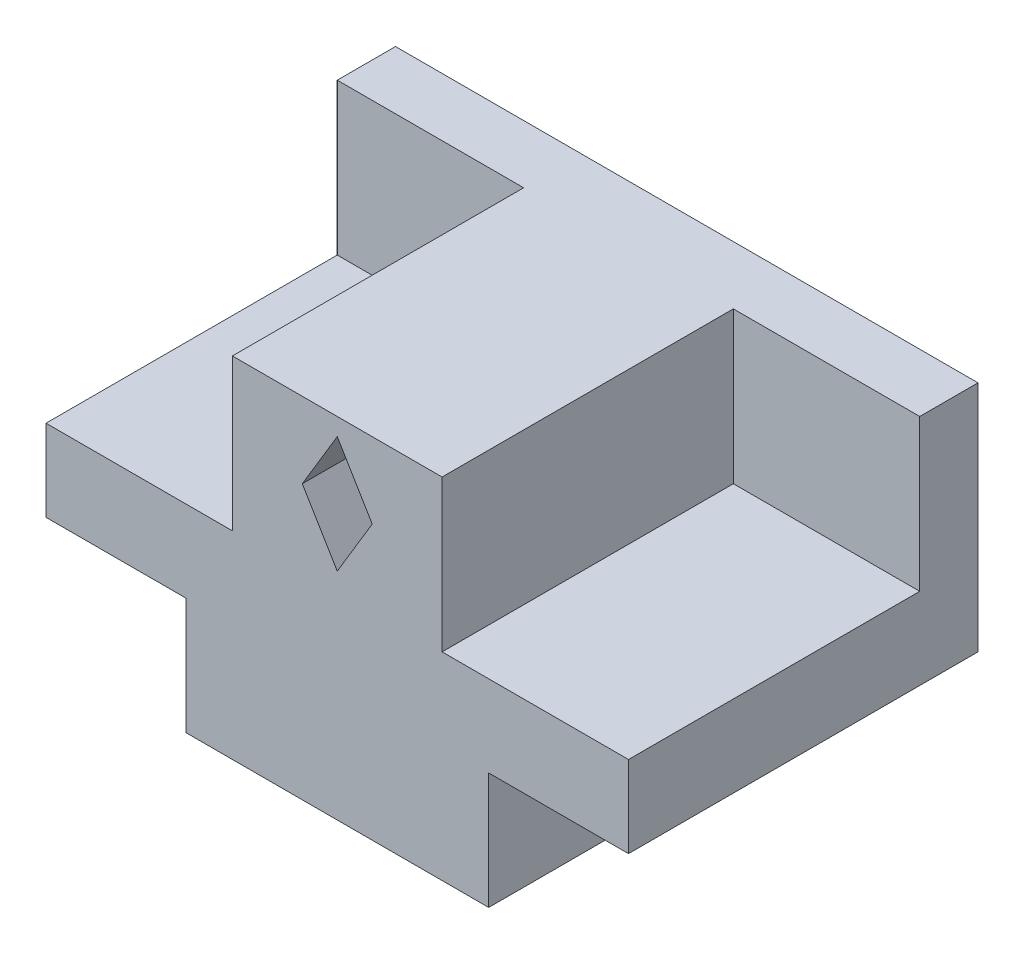
ISO-10303-21;
HEADER;
FILE_DESCRIPTION(('STEP AP214'),'2;1');
FILE_NAME('part.step','',(''),(''),'','','');
FILE_SCHEMA(('AUTOMOTIVE_DESIGN { 1 0 10303 214 1 1 1 1 }'));
ENDSEC;
DATA;
#1=APPLICATION_CONTEXT('core data for automotive mechanical design processes');
#2=APPLICATION_PROTOCOL_DEFINITION('international standard','automotive_design',2000,#1);
#3=PRODUCT_CONTEXT('',#1,'mechanical');
#4=PRODUCT('Part','Part','',(#3));
#5=PRODUCT_RELATED_PRODUCT_CATEGORY('part','',(#4));
#6=PRODUCT_DEFINITION_FORMATION('','',#4);
#7=PRODUCT_DEFINITION_CONTEXT('part definition',#1,'design');
#8=PRODUCT_DEFINITION('design','',#6,#7);
#9=PRODUCT_DEFINITION_SHAPE('','',#8);
#10=(LENGTH_UNIT() NAMED_UNIT(*) SI_UNIT(.MILLI.,.METRE.));
#11=(NAMED_UNIT(*) PLANE_ANGLE_UNIT() SI_UNIT($,.RADIAN.));
#12=(NAMED_UNIT(*) SI_UNIT($,.STERADIAN.) SOLID_ANGLE_UNIT());
#13=UNCERTAINTY_MEASURE_WITH_UNIT(LENGTH_MEASURE(1.E-05),#10,'distance_accuracy_value','');
#14=(GEOMETRIC_REPRESENTATION_CONTEXT(3) GLOBAL_UNCERTAINTY_ASSIGNED_CONTEXT((#13)) GLOBAL_UNIT_ASSIGNED_CONTEXT((#10,
#11,#12)) REPRESENTATION_CONTEXT('',''));
#15=CARTESIAN_POINT('',(0.,0.,0.));
#16=DIRECTION('',(0.,0.,1.));
#17=DIRECTION('',(1.,0.,0.));
#18=AXIS2_PLACEMENT_3D('',#15,#16,#17);
#19=CARTESIAN_POINT('',(9.,0.,30.));
#20=DIRECTION('',(1.,0.,0.));
#21=DIRECTION('',(0.,1.,0.));
#22=AXIS2_PLACEMENT_3D('',#19,#20,#21);
#23=PLANE('',#22);
#24=DIRECTION('',(0.,0.,-1.));
#25=VECTOR('',#24,1.);
#26=CARTESIAN_POINT('',(9.,17.,30.));
#27=LINE('',#26,#25);
#28=CARTESIAN_POINT('',(9.,17.,30.));
#29=VERTEX_POINT('',#28);
#30=CARTESIAN_POINT('',(9.,17.,5.));
#31=VERTEX_POINT('',#30);
#32=EDGE_CURVE('E269',#29,#31,#27,.T.);
#33=ORIENTED_EDGE('',*,*,#32,.T.);
#34=DIRECTION('',(0.,1.,0.));
#35=VECTOR('',#34,1.);
#36=CARTESIAN_POINT('',(9.,0.,5.));
#37=LINE('',#36,#35);
#38=CARTESIAN_POINT('',(9.,30.,5.));
#39=VERTEX_POINT('',#38);
#40=EDGE_CURVE('E50',#31,#39,#37,.T.);
#41=ORIENTED_EDGE('',*,*,#40,.T.);
#42=DIRECTION('',(0.,0.,-1.));
#43=VECTOR('',#42,1.);
#44=CARTESIAN_POINT('',(9.,30.,30.));
#45=LINE('',#44,#43);
#46=CARTESIAN_POINT('',(9.,30.,30.));
#47=VERTEX_POINT('',#46);
#48=EDGE_CURVE('E11',#47,#39,#45,.T.);
#49=ORIENTED_EDGE('',*,*,#48,.F.);
#50=DIRECTION('',(0.,-1.,0.));
#51=VECTOR('',#50,1.);
#52=CARTESIAN_POINT('',(9.,0.,30.));
#53=LINE('',#52,#51);
#54=EDGE_CURVE('E246',#47,#29,#53,.T.);
#55=ORIENTED_EDGE('',*,*,#54,.T.);
#56=EDGE_LOOP('',(#33,#41,#49,#55));
#57=FACE_BOUND('',#56,.T.);
#58=ADVANCED_FACE('F36',(#57),#23,.T.);
#59=CARTESIAN_POINT('',(0.,17.,30.));
#60=DIRECTION('',(0.,-1.,0.));
#61=DIRECTION('',(0.,0.,-1.));
#62=AXIS2_PLACEMENT_3D('',#59,#60,#61);
#63=PLANE('',#62);
#64=DIRECTION('',(1.,0.,0.));
#65=VECTOR('',#64,1.);
#66=CARTESIAN_POINT('',(0.,17.,5.));
#67=LINE('',#66,#65);
#68=CARTESIAN_POINT('',(25.,17.,5.));
#69=VERTEX_POINT('',#68);
#70=EDGE_CURVE('E197',#31,#69,#67,.T.);
#71=ORIENTED_EDGE('',*,*,#70,.F.);
#72=ORIENTED_EDGE('',*,*,#32,.F.);
#73=DIRECTION('',(-1.,0.,0.));
#74=VECTOR('',#73,1.);
#75=CARTESIAN_POINT('',(0.,17.,30.));
#76=LINE('',#75,#74);
#77=CARTESIAN_POINT('',(25.,17.,30.));
#78=VERTEX_POINT('',#77);
#79=EDGE_CURVE('E267',#78,#29,#76,.T.);
#80=ORIENTED_EDGE('',*,*,#79,.F.);
#81=DIRECTION('',(0.,0.,-1.));
#82=VECTOR('',#81,1.);
#83=CARTESIAN_POINT('',(25.,17.,30.));
#84=LINE('',#83,#82);
#85=EDGE_CURVE('E57',#78,#69,#84,.T.);
#86=ORIENTED_EDGE('',*,*,#85,.T.);
#87=EDGE_LOOP('',(#71,#72,#80,#86));
#88=FACE_BOUND('',#87,.T.);
#89=ADVANCED_FACE('F333',(#88),#63,.F.);
#90=CARTESIAN_POINT('',(-9.,0.,30.));
#91=DIRECTION('',(1.,0.,0.));
#92=DIRECTION('',(0.,1.,0.));
#93=AXIS2_PLACEMENT_3D('',#90,#91,#92);
#94=PLANE('',#93);
#95=DIRECTION('',(0.,1.,0.));
#96=VECTOR('',#95,1.);
#97=CARTESIAN_POINT('',(-9.,0.,5.));
#98=LINE('',#97,#96);
#99=CARTESIAN_POINT('',(-9.,17.,5.));
#100=VERTEX_POINT('',#99);
#101=CARTESIAN_POINT('',(-9.,30.,5.));
#102=VERTEX_POINT('',#101);
#103=EDGE_CURVE('E188',#100,#102,#98,.T.);
#104=ORIENTED_EDGE('',*,*,#103,.F.);
#105=DIRECTION('',(0.,0.,-1.));
#106=VECTOR('',#105,1.);
#107=CARTESIAN_POINT('',(-9.,17.,30.));
#108=LINE('',#107,#106);
#109=CARTESIAN_POINT('',(-9.,17.,30.));
#110=VERTEX_POINT('',#109);
#111=EDGE_CURVE('E243',#110,#100,#108,.T.);
#112=ORIENTED_EDGE('',*,*,#111,.F.);
#113=DIRECTION('',(0.,-1.,0.));
#114=VECTOR('',#113,1.);
#115=CARTESIAN_POINT('',(-9.,0.,30.));
#116=LINE('',#115,#114);
#117=CARTESIAN_POINT('',(-9.,30.,30.));
#118=VERTEX_POINT('',#117);
#119=EDGE_CURVE('E201',#118,#110,#116,.T.);
#120=ORIENTED_EDGE('',*,*,#119,.F.);
#121=DIRECTION('',(0.,0.,-1.));
#122=VECTOR('',#121,1.);
#123=CARTESIAN_POINT('',(-9.,30.,30.));
#124=LINE('',#123,#122);
#125=EDGE_CURVE('E219',#118,#102,#124,.T.);
#126=ORIENTED_EDGE('',*,*,#125,.T.);
#127=EDGE_LOOP('',(#104,#112,#120,#126));
#128=FACE_BOUND('',#127,.T.);
#129=ADVANCED_FACE('F337',(#128),#94,.F.);
#130=CARTESIAN_POINT('',(0.,17.,30.));
#131=DIRECTION('',(0.,1.,0.));
#132=DIRECTION('',(0.,0.,1.));
#133=AXIS2_PLACEMENT_3D('',#130,#131,#132);
#134=PLANE('',#133);
#135=ORIENTED_EDGE('',*,*,#111,.T.);
#136=DIRECTION('',(-1.,0.,0.));
#137=VECTOR('',#136,1.);
#138=CARTESIAN_POINT('',(0.,17.,5.));
#139=LINE('',#138,#137);
#140=CARTESIAN_POINT('',(-25.,17.,5.));
#141=VERTEX_POINT('',#140);
#142=EDGE_CURVE('E193',#100,#141,#139,.T.);
#143=ORIENTED_EDGE('',*,*,#142,.T.);
#144=DIRECTION('',(0.,0.,-1.));
#145=VECTOR('',#144,1.);
#146=CARTESIAN_POINT('',(-25.,17.,30.));
#147=LINE('',#146,#145);
#148=CARTESIAN_POINT('',(-25.,17.,30.));
#149=VERTEX_POINT('',#148);
#150=EDGE_CURVE('E167',#149,#141,#147,.T.);
#151=ORIENTED_EDGE('',*,*,#150,.F.);
#152=DIRECTION('',(1.,0.,0.));
#153=VECTOR('',#152,1.);
#154=CARTESIAN_POINT('',(0.,17.,30.));
#155=LINE('',#154,#153);
#156=EDGE_CURVE('E203',#149,#110,#155,.T.);
#157=ORIENTED_EDGE('',*,*,#156,.T.);
#158=EDGE_LOOP('',(#135,#143,#151,#157));
#159=FACE_BOUND('',#158,.T.);
#160=ADVANCED_FACE('F362',(#159),#134,.T.);
#161=CARTESIAN_POINT('',(0.,30.,30.));
#162=DIRECTION('',(0.,1.,0.));
#163=DIRECTION('',(0.,0.,1.));
#164=AXIS2_PLACEMENT_3D('',#161,#162,#163);
#165=PLANE('',#164);
#166=DIRECTION('',(1.,0.,0.));
#167=VECTOR('',#166,1.);
#168=CARTESIAN_POINT('',(-25.,30.,5.));
#169=LINE('',#168,#167);
#170=CARTESIAN_POINT('',(-25.,30.,5.));
#171=VERTEX_POINT('',#170);
#172=EDGE_CURVE('E177',#171,#102,#169,.T.);
#173=ORIENTED_EDGE('',*,*,#172,.T.);
#174=ORIENTED_EDGE('',*,*,#125,.F.);
#175=DIRECTION('',(1.,0.,0.));
#176=VECTOR('',#175,1.);
#177=CARTESIAN_POINT('',(0.,30.,30.));
#178=LINE('',#177,#176);
#179=EDGE_CURVE('E249',#118,#47,#178,.T.);
#180=ORIENTED_EDGE('',*,*,#179,.T.);
#181=ORIENTED_EDGE('',*,*,#48,.T.);
#182=CARTESIAN_POINT('',(25.,30.,5.));
#183=VERTEX_POINT('',#182);
#184=EDGE_CURVE('E171',#39,#183,#169,.T.);
#185=ORIENTED_EDGE('',*,*,#184,.T.);
#186=DIRECTION('',(0.,0.,-1.));
#187=VECTOR('',#186,1.);
#188=CARTESIAN_POINT('',(25.,30.,5.));
#189=LINE('',#188,#187);
#190=CARTESIAN_POINT('',(25.,30.,0.));
#191=VERTEX_POINT('',#190);
#192=EDGE_CURVE('E183',#183,#191,#189,.T.);
#193=ORIENTED_EDGE('',*,*,#192,.T.);
#194=DIRECTION('',(1.,0.,0.));
#195=VECTOR('',#194,1.);
#196=CARTESIAN_POINT('',(0.,30.,0.));
#197=LINE('',#196,#195);
#198=CARTESIAN_POINT('',(-25.,30.,0.));
#199=VERTEX_POINT('',#198);
#200=EDGE_CURVE('E181',#199,#191,#197,.T.);
#201=ORIENTED_EDGE('',*,*,#200,.F.);
#202=DIRECTION('',(0.,0.,-1.));
#203=VECTOR('',#202,1.);
#204=CARTESIAN_POINT('',(-25.,30.,5.));
#205=LINE('',#204,#203);
#206=EDGE_CURVE('E165',#171,#199,#205,.T.);
#207=ORIENTED_EDGE('',*,*,#206,.F.);
#208=EDGE_LOOP('',(#173,#174,#180,#181,#185,#193,#201,#207));
#209=FACE_BOUND('',#208,.T.);
#210=ADVANCED_FACE('F175',(#209),#165,.T.);
#211=CARTESIAN_POINT('',(12.5735294117647,7.54411764705882,30.));
#212=DIRECTION('',(0.857492925712544,0.514495755427526,0.));
#213=DIRECTION('',(-0.514495755427526,0.857492925712544,0.));
#214=AXIS2_PLACEMENT_3D('',#211,#212,#213);
#215=PLANE('',#214);
#216=DIRECTION('',(0.514495755427526,-0.857492925712544,0.));
#217=VECTOR('',#216,1.);
#218=CARTESIAN_POINT('',(12.5735294117647,7.54411764705882,0.));
#219=LINE('',#218,#217);
#220=CARTESIAN_POINT('',(0.,28.5,0.));
#221=VERTEX_POINT('',#220);
#222=CARTESIAN_POINT('',(3.,23.5,0.));
#223=VERTEX_POINT('',#222);
#224=EDGE_CURVE('E271',#221,#223,#219,.T.);
#225=ORIENTED_EDGE('',*,*,#224,.T.);
#226=DIRECTION('',(0.,0.,-1.));
#227=VECTOR('',#226,1.);
#228=CARTESIAN_POINT('',(3.,23.5,30.));
#229=LINE('',#228,#227);
#230=CARTESIAN_POINT('',(3.,23.5,30.));
#231=VERTEX_POINT('',#230);
#232=EDGE_CURVE('E297',#231,#223,#229,.T.);
#233=ORIENTED_EDGE('',*,*,#232,.F.);
#234=DIRECTION('',(0.514495755427526,-0.857492925712544,0.));
#235=VECTOR('',#234,1.);
#236=CARTESIAN_POINT('',(12.5735294117647,7.54411764705882,30.));
#237=LINE('',#236,#235);
#238=CARTESIAN_POINT('',(0.,28.5,30.));
#239=VERTEX_POINT('',#238);
#240=EDGE_CURVE('E253',#239,#231,#237,.T.);
#241=ORIENTED_EDGE('',*,*,#240,.F.);
#242=DIRECTION('',(0.,0.,-1.));
#243=VECTOR('',#242,1.);
#244=CARTESIAN_POINT('',(0.,28.5,30.));
#245=LINE('',#244,#243);
#246=EDGE_CURVE('E43',#239,#221,#245,.T.);
#247=ORIENTED_EDGE('',*,*,#246,.T.);
#248=EDGE_LOOP('',(#225,#233,#241,#247));
#249=FACE_BOUND('',#248,.T.);
#250=ADVANCED_FACE('F301',(#249),#215,.F.);
#251=CARTESIAN_POINT('',(-8.16176470588235,4.89705882352941,30.));
#252=DIRECTION('',(0.857492925712544,-0.514495755427526,0.));
#253=DIRECTION('',(0.514495755427526,0.857492925712544,0.));
#254=AXIS2_PLACEMENT_3D('',#251,#252,#253);
#255=PLANE('',#254);
#256=DIRECTION('',(-0.514495755427526,-0.857492925712544,0.));
#257=VECTOR('',#256,1.);
#258=CARTESIAN_POINT('',(-8.16176470588235,4.89705882352941,0.));
#259=LINE('',#258,#257);
#260=CARTESIAN_POINT('',(0.,18.5,0.));
#261=VERTEX_POINT('',#260);
#262=EDGE_CURVE('E274',#223,#261,#259,.T.);
#263=ORIENTED_EDGE('',*,*,#262,.T.);
#264=DIRECTION('',(0.,0.,-1.));
#265=VECTOR('',#264,1.);
#266=CARTESIAN_POINT('',(0.,18.5,30.));
#267=LINE('',#266,#265);
#268=CARTESIAN_POINT('',(0.,18.5,30.));
#269=VERTEX_POINT('',#268);
#270=EDGE_CURVE('E295',#269,#261,#267,.T.);
#271=ORIENTED_EDGE('',*,*,#270,.F.);
#272=DIRECTION('',(-0.514495755427526,-0.857492925712544,0.));
#273=VECTOR('',#272,1.);
#274=CARTESIAN_POINT('',(-8.16176470588235,4.89705882352941,30.));
#275=LINE('',#274,#273);
#276=EDGE_CURVE('E255',#231,#269,#275,.T.);
#277=ORIENTED_EDGE('',*,*,#276,.F.);
#278=ORIENTED_EDGE('',*,*,#232,.T.);
#279=EDGE_LOOP('',(#263,#271,#277,#278));
#280=FACE_BOUND('',#279,.T.);
#281=ADVANCED_FACE('F313',(#280),#255,.F.);
#282=CARTESIAN_POINT('',(0.,0.,30.));
#283=DIRECTION('',(0.,1.,0.));
#284=DIRECTION('',(0.,0.,1.));
#285=AXIS2_PLACEMENT_3D('',#282,#283,#284);
#286=PLANE('',#285);
#287=DIRECTION('',(1.,0.,0.));
#288=VECTOR('',#287,1.);
#289=CARTESIAN_POINT('',(0.,0.,0.));
#290=LINE('',#289,#288);
#291=CARTESIAN_POINT('',(-13.,0.,0.));
#292=VERTEX_POINT('',#291);
#293=CARTESIAN_POINT('',(13.,0.,0.));
#294=VERTEX_POINT('',#293);
#295=EDGE_CURVE('E277',#292,#294,#290,.T.);
#296=ORIENTED_EDGE('',*,*,#295,.T.);
#297=DIRECTION('',(0.,0.,-1.));
#298=VECTOR('',#297,1.);
#299=CARTESIAN_POINT('',(13.,0.,30.));
#300=LINE('',#299,#298);
#301=CARTESIAN_POINT('',(13.,0.,30.));
#302=VERTEX_POINT('',#301);
#303=EDGE_CURVE('E292',#302,#294,#300,.T.);
#304=ORIENTED_EDGE('',*,*,#303,.F.);
#305=DIRECTION('',(1.,0.,0.));
#306=VECTOR('',#305,1.);
#307=CARTESIAN_POINT('',(0.,0.,30.));
#308=LINE('',#307,#306);
#309=CARTESIAN_POINT('',(-13.,0.,30.));
#310=VERTEX_POINT('',#309);
#311=EDGE_CURVE('E258',#310,#302,#308,.T.);
#312=ORIENTED_EDGE('',*,*,#311,.F.);
#313=DIRECTION('',(0.,0.,-1.));
#314=VECTOR('',#313,1.);
#315=CARTESIAN_POINT('',(-13.,0.,30.));
#316=LINE('',#315,#314);
#317=EDGE_CURVE('E235',#310,#292,#316,.T.);
#318=ORIENTED_EDGE('',*,*,#317,.T.);
#319=EDGE_LOOP('',(#296,#304,#312,#318));
#320=FACE_BOUND('',#319,.T.);
#321=ADVANCED_FACE('F374',(#320),#286,.F.);
#322=CARTESIAN_POINT('',(13.,0.,30.));
#323=DIRECTION('',(-1.,0.,0.));
#324=DIRECTION('',(0.,0.,1.));
#325=AXIS2_PLACEMENT_3D('',#322,#323,#324);
#326=PLANE('',#325);
#327=DIRECTION('',(0.,1.,0.));
#328=VECTOR('',#327,1.);
#329=CARTESIAN_POINT('',(13.,0.,0.));
#330=LINE('',#329,#328);
#331=CARTESIAN_POINT('',(13.,10.,0.));
#332=VERTEX_POINT('',#331);
#333=EDGE_CURVE('E279',#294,#332,#330,.T.);
#334=ORIENTED_EDGE('',*,*,#333,.T.);
#335=DIRECTION('',(0.,0.,-1.));
#336=VECTOR('',#335,1.);
#337=CARTESIAN_POINT('',(13.,10.,30.));
#338=LINE('',#337,#336);
#339=CARTESIAN_POINT('',(13.,10.,30.));
#340=VERTEX_POINT('',#339);
#341=EDGE_CURVE('E290',#340,#332,#338,.T.);
#342=ORIENTED_EDGE('',*,*,#341,.F.);
#343=DIRECTION('',(0.,1.,0.));
#344=VECTOR('',#343,1.);
#345=CARTESIAN_POINT('',(13.,0.,30.));
#346=LINE('',#345,#344);
#347=EDGE_CURVE('E260',#302,#340,#346,.T.);
#348=ORIENTED_EDGE('',*,*,#347,.F.);
#349=ORIENTED_EDGE('',*,*,#303,.T.);
#350=EDGE_LOOP('',(#334,#342,#348,#349));
#351=FACE_BOUND('',#350,.T.);
#352=ADVANCED_FACE('F371',(#351),#326,.F.);
#353=CARTESIAN_POINT('',(0.,9.99999999999999,30.));
#354=DIRECTION('',(0.,-1.,0.));
#355=DIRECTION('',(1.,0.,0.));
#356=AXIS2_PLACEMENT_3D('',#353,#354,#355);
#357=PLANE('',#356);
#358=DIRECTION('',(-1.,0.,0.));
#359=VECTOR('',#358,1.);
#360=CARTESIAN_POINT('',(0.,9.99999999999999,0.));
#361=LINE('',#360,#359);
#362=CARTESIAN_POINT('',(25.,10.,0.));
#363=VERTEX_POINT('',#362);
#364=EDGE_CURVE('E282',#363,#332,#361,.T.);
#365=ORIENTED_EDGE('',*,*,#364,.F.);
#366=DIRECTION('',(0.,0.,-1.));
#367=VECTOR('',#366,1.);
#368=CARTESIAN_POINT('',(25.,10.,30.));
#369=LINE('',#368,#367);
#370=CARTESIAN_POINT('',(25.,10.,30.));
#371=VERTEX_POINT('',#370);
#372=EDGE_CURVE('E288',#371,#363,#369,.T.);
#373=ORIENTED_EDGE('',*,*,#372,.F.);
#374=DIRECTION('',(-1.,0.,0.));
#375=VECTOR('',#374,1.);
#376=CARTESIAN_POINT('',(0.,9.99999999999999,30.));
#377=LINE('',#376,#375);
#378=EDGE_CURVE('E262',#371,#340,#377,.T.);
#379=ORIENTED_EDGE('',*,*,#378,.T.);
#380=ORIENTED_EDGE('',*,*,#341,.T.);
#381=EDGE_LOOP('',(#365,#373,#379,#380));
#382=FACE_BOUND('',#381,.T.);
#383=ADVANCED_FACE('F368',(#382),#357,.T.);
#384=CARTESIAN_POINT('',(25.,0.,30.));
#385=DIRECTION('',(-1.,0.,0.));
#386=DIRECTION('',(0.,0.,1.));
#387=AXIS2_PLACEMENT_3D('',#384,#385,#386);
#388=PLANE('',#387);
#389=DIRECTION('',(0.,1.,0.));
#390=VECTOR('',#389,1.);
#391=CARTESIAN_POINT('',(25.,0.,0.));
#392=LINE('',#391,#390);
#393=EDGE_CURVE('E250',#363,#191,#392,.T.);
#394=ORIENTED_EDGE('',*,*,#393,.T.);
#395=ORIENTED_EDGE('',*,*,#192,.F.);
#396=DIRECTION('',(0.,-1.,0.));
#397=VECTOR('',#396,1.);
#398=CARTESIAN_POINT('',(25.,10.,5.));
#399=LINE('',#398,#397);
#400=EDGE_CURVE('E184',#183,#69,#399,.T.);
#401=ORIENTED_EDGE('',*,*,#400,.T.);
#402=ORIENTED_EDGE('',*,*,#85,.F.);
#403=DIRECTION('',(0.,1.,0.));
#404=VECTOR('',#403,1.);
#405=CARTESIAN_POINT('',(25.,0.,30.));
#406=LINE('',#405,#404);
#407=EDGE_CURVE('E265',#371,#78,#406,.T.);
#408=ORIENTED_EDGE('',*,*,#407,.F.);
#409=ORIENTED_EDGE('',*,*,#372,.T.);
#410=EDGE_LOOP('',(#394,#395,#401,#402,#408,#409));
#411=FACE_BOUND('',#410,.T.);
#412=ADVANCED_FACE('F347',(#411),#388,.F.);
#413=CARTESIAN_POINT('',(0.,0.,30.));
#414=DIRECTION('',(0.,0.,1.));
#415=DIRECTION('',(1.,0.,0.));
#416=AXIS2_PLACEMENT_3D('',#413,#414,#415);
#417=PLANE('',#416);
#418=ORIENTED_EDGE('',*,*,#276,.T.);
#419=DIRECTION('',(0.514495755427526,-0.857492925712544,0.));
#420=VECTOR('',#419,1.);
#421=CARTESIAN_POINT('',(8.16176470588235,4.89705882352941,30.));
#422=LINE('',#421,#420);
#423=CARTESIAN_POINT('',(-3.,23.5,30.));
#424=VERTEX_POINT('',#423);
#425=EDGE_CURVE('E214',#424,#269,#422,.T.);
#426=ORIENTED_EDGE('',*,*,#425,.F.);
#427=DIRECTION('',(-0.514495755427526,-0.857492925712544,0.));
#428=VECTOR('',#427,1.);
#429=CARTESIAN_POINT('',(-12.5735294117647,7.54411764705882,30.));
#430=LINE('',#429,#428);
#431=EDGE_CURVE('E216',#239,#424,#430,.T.);
#432=ORIENTED_EDGE('',*,*,#431,.F.);
#433=ORIENTED_EDGE('',*,*,#240,.T.);
#434=EDGE_LOOP('',(#418,#426,#432,#433));
#435=FACE_BOUND('',#434,.T.);
#436=ORIENTED_EDGE('',*,*,#54,.F.);
#437=ORIENTED_EDGE('',*,*,#179,.F.);
#438=ORIENTED_EDGE('',*,*,#119,.T.);
#439=ORIENTED_EDGE('',*,*,#156,.F.);
#440=DIRECTION('',(0.,1.,0.));
#441=VECTOR('',#440,1.);
#442=CARTESIAN_POINT('',(-25.,0.,30.));
#443=LINE('',#442,#441);
#444=CARTESIAN_POINT('',(-25.,10.,30.));
#445=VERTEX_POINT('',#444);
#446=EDGE_CURVE('E207',#445,#149,#443,.T.);
#447=ORIENTED_EDGE('',*,*,#446,.F.);
#448=DIRECTION('',(1.,0.,0.));
#449=VECTOR('',#448,1.);
#450=CARTESIAN_POINT('',(0.,9.99999999999999,30.));
#451=LINE('',#450,#449);
#452=CARTESIAN_POINT('',(-13.,10.,30.));
#453=VERTEX_POINT('',#452);
#454=EDGE_CURVE('E209',#445,#453,#451,.T.);
#455=ORIENTED_EDGE('',*,*,#454,.T.);
#456=DIRECTION('',(0.,1.,0.));
#457=VECTOR('',#456,1.);
#458=CARTESIAN_POINT('',(-13.,0.,30.));
#459=LINE('',#458,#457);
#460=EDGE_CURVE('E211',#310,#453,#459,.T.);
#461=ORIENTED_EDGE('',*,*,#460,.F.);
#462=ORIENTED_EDGE('',*,*,#311,.T.);
#463=ORIENTED_EDGE('',*,*,#347,.T.);
#464=ORIENTED_EDGE('',*,*,#378,.F.);
#465=ORIENTED_EDGE('',*,*,#407,.T.);
#466=ORIENTED_EDGE('',*,*,#79,.T.);
#467=EDGE_LOOP('',(#436,#437,#438,#439,#447,#455,#461,#462,#463,#464,#465,#466));
#468=FACE_BOUND('',#467,.T.);
#469=ADVANCED_FACE('F317',(#435,#468),#417,.T.);
#470=CARTESIAN_POINT('',(0.,0.,0.));
#471=DIRECTION('',(0.,0.,1.));
#472=DIRECTION('',(1.,0.,0.));
#473=AXIS2_PLACEMENT_3D('',#470,#471,#472);
#474=PLANE('',#473);
#475=DIRECTION('',(0.,1.,0.));
#476=VECTOR('',#475,1.);
#477=CARTESIAN_POINT('',(-13.,0.,0.));
#478=LINE('',#477,#476);
#479=CARTESIAN_POINT('',(-13.,10.,0.));
#480=VERTEX_POINT('',#479);
#481=EDGE_CURVE('E224',#292,#480,#478,.T.);
#482=ORIENTED_EDGE('',*,*,#481,.T.);
#483=DIRECTION('',(1.,0.,0.));
#484=VECTOR('',#483,1.);
#485=CARTESIAN_POINT('',(0.,9.99999999999999,0.));
#486=LINE('',#485,#484);
#487=CARTESIAN_POINT('',(-25.,10.,0.));
#488=VERTEX_POINT('',#487);
#489=EDGE_CURVE('E221',#488,#480,#486,.T.);
#490=ORIENTED_EDGE('',*,*,#489,.F.);
#491=DIRECTION('',(0.,1.,0.));
#492=VECTOR('',#491,1.);
#493=CARTESIAN_POINT('',(-25.,0.,0.));
#494=LINE('',#493,#492);
#495=EDGE_CURVE('E200',#488,#199,#494,.T.);
#496=ORIENTED_EDGE('',*,*,#495,.T.);
#497=ORIENTED_EDGE('',*,*,#200,.T.);
#498=ORIENTED_EDGE('',*,*,#393,.F.);
#499=ORIENTED_EDGE('',*,*,#364,.T.);
#500=ORIENTED_EDGE('',*,*,#333,.F.);
#501=ORIENTED_EDGE('',*,*,#295,.F.);
#502=EDGE_LOOP('',(#482,#490,#496,#497,#498,#499,#500,#501));
#503=FACE_BOUND('',#502,.T.);
#504=DIRECTION('',(0.514495755427526,-0.857492925712544,0.));
#505=VECTOR('',#504,1.);
#506=CARTESIAN_POINT('',(8.16176470588235,4.89705882352941,0.));
#507=LINE('',#506,#505);
#508=CARTESIAN_POINT('',(-3.,23.5,0.));
#509=VERTEX_POINT('',#508);
#510=EDGE_CURVE('E227',#509,#261,#507,.T.);
#511=ORIENTED_EDGE('',*,*,#510,.T.);
#512=ORIENTED_EDGE('',*,*,#262,.F.);
#513=ORIENTED_EDGE('',*,*,#224,.F.);
#514=DIRECTION('',(-0.514495755427526,-0.857492925712544,0.));
#515=VECTOR('',#514,1.);
#516=CARTESIAN_POINT('',(-12.5735294117647,7.54411764705882,0.));
#517=LINE('',#516,#515);
#518=EDGE_CURVE('E204',#221,#509,#517,.T.);
#519=ORIENTED_EDGE('',*,*,#518,.T.);
#520=EDGE_LOOP('',(#511,#512,#513,#519));
#521=FACE_BOUND('',#520,.T.);
#522=ADVANCED_FACE('F310',(#503,#521),#474,.F.);
#523=CARTESIAN_POINT('',(-25.,0.,30.));
#524=DIRECTION('',(-1.,0.,0.));
#525=DIRECTION('',(0.,0.,1.));
#526=AXIS2_PLACEMENT_3D('',#523,#524,#525);
#527=PLANE('',#526);
#528=ORIENTED_EDGE('',*,*,#495,.F.);
#529=DIRECTION('',(0.,0.,-1.));
#530=VECTOR('',#529,1.);
#531=CARTESIAN_POINT('',(-25.,10.,30.));
#532=LINE('',#531,#530);
#533=EDGE_CURVE('E240',#445,#488,#532,.T.);
#534=ORIENTED_EDGE('',*,*,#533,.F.);
#535=ORIENTED_EDGE('',*,*,#446,.T.);
#536=ORIENTED_EDGE('',*,*,#150,.T.);
#537=DIRECTION('',(0.,1.,0.));
#538=VECTOR('',#537,1.);
#539=CARTESIAN_POINT('',(-25.,10.,5.));
#540=LINE('',#539,#538);
#541=EDGE_CURVE('E161',#141,#171,#540,.T.);
#542=ORIENTED_EDGE('',*,*,#541,.T.);
#543=ORIENTED_EDGE('',*,*,#206,.T.);
#544=EDGE_LOOP('',(#528,#534,#535,#536,#542,#543));
#545=FACE_BOUND('',#544,.T.);
#546=ADVANCED_FACE('F164',(#545),#527,.T.);
#547=CARTESIAN_POINT('',(0.,9.99999999999999,30.));
#548=DIRECTION('',(0.,1.,0.));
#549=DIRECTION('',(-1.,0.,0.));
#550=AXIS2_PLACEMENT_3D('',#547,#548,#549);
#551=PLANE('',#550);
#552=ORIENTED_EDGE('',*,*,#489,.T.);
#553=DIRECTION('',(0.,0.,-1.));
#554=VECTOR('',#553,1.);
#555=CARTESIAN_POINT('',(-13.,10.,30.));
#556=LINE('',#555,#554);
#557=EDGE_CURVE('E238',#453,#480,#556,.T.);
#558=ORIENTED_EDGE('',*,*,#557,.F.);
#559=ORIENTED_EDGE('',*,*,#454,.F.);
#560=ORIENTED_EDGE('',*,*,#533,.T.);
#561=EDGE_LOOP('',(#552,#558,#559,#560));
#562=FACE_BOUND('',#561,.T.);
#563=ADVANCED_FACE('F329',(#562),#551,.F.);
#564=CARTESIAN_POINT('',(-13.,0.,30.));
#565=DIRECTION('',(-1.,0.,0.));
#566=DIRECTION('',(0.,0.,1.));
#567=AXIS2_PLACEMENT_3D('',#564,#565,#566);
#568=PLANE('',#567);
#569=ORIENTED_EDGE('',*,*,#481,.F.);
#570=ORIENTED_EDGE('',*,*,#317,.F.);
#571=ORIENTED_EDGE('',*,*,#460,.T.);
#572=ORIENTED_EDGE('',*,*,#557,.T.);
#573=EDGE_LOOP('',(#569,#570,#571,#572));
#574=FACE_BOUND('',#573,.T.);
#575=ADVANCED_FACE('F322',(#574),#568,.T.);
#576=CARTESIAN_POINT('',(8.16176470588235,4.89705882352941,30.));
#577=DIRECTION('',(0.857492925712544,0.514495755427526,0.));
#578=DIRECTION('',(-0.514495755427526,0.857492925712544,0.));
#579=AXIS2_PLACEMENT_3D('',#576,#577,#578);
#580=PLANE('',#579);
#581=ORIENTED_EDGE('',*,*,#510,.F.);
#582=DIRECTION('',(0.,0.,-1.));
#583=VECTOR('',#582,1.);
#584=CARTESIAN_POINT('',(-3.,23.5,30.));
#585=LINE('',#584,#583);
#586=EDGE_CURVE('E233',#424,#509,#585,.T.);
#587=ORIENTED_EDGE('',*,*,#586,.F.);
#588=ORIENTED_EDGE('',*,*,#425,.T.);
#589=ORIENTED_EDGE('',*,*,#270,.T.);
#590=EDGE_LOOP('',(#581,#587,#588,#589));
#591=FACE_BOUND('',#590,.T.);
#592=ADVANCED_FACE('F320',(#591),#580,.T.);
#593=CARTESIAN_POINT('',(-12.5735294117647,7.54411764705882,30.));
#594=DIRECTION('',(0.857492925712544,-0.514495755427526,0.));
#595=DIRECTION('',(0.514495755427526,0.857492925712544,0.));
#596=AXIS2_PLACEMENT_3D('',#593,#594,#595);
#597=PLANE('',#596);
#598=ORIENTED_EDGE('',*,*,#518,.F.);
#599=ORIENTED_EDGE('',*,*,#246,.F.);
#600=ORIENTED_EDGE('',*,*,#431,.T.);
#601=ORIENTED_EDGE('',*,*,#586,.T.);
#602=EDGE_LOOP('',(#598,#599,#600,#601));
#603=FACE_BOUND('',#602,.T.);
#604=ADVANCED_FACE('F307',(#603),#597,.T.);
#605=CARTESIAN_POINT('',(0.,0.,5.));
#606=DIRECTION('',(0.,0.,-1.));
#607=DIRECTION('',(-1.,0.,0.));
#608=AXIS2_PLACEMENT_3D('',#605,#606,#607);
#609=PLANE('',#608);
#610=ORIENTED_EDGE('',*,*,#142,.F.);
#611=ORIENTED_EDGE('',*,*,#103,.T.);
#612=ORIENTED_EDGE('',*,*,#172,.F.);
#613=ORIENTED_EDGE('',*,*,#541,.F.);
#614=EDGE_LOOP('',(#610,#611,#612,#613));
#615=FACE_BOUND('',#614,.T.);
#616=ADVANCED_FACE('F186',(#615),#609,.F.);
#617=ORIENTED_EDGE('',*,*,#40,.F.);
#618=ORIENTED_EDGE('',*,*,#70,.T.);
#619=ORIENTED_EDGE('',*,*,#400,.F.);
#620=ORIENTED_EDGE('',*,*,#184,.F.);
#621=EDGE_LOOP('',(#617,#618,#619,#620));
#622=FACE_BOUND('',#621,.T.);
#623=ADVANCED_FACE('F343',(#622),#609,.F.);
#624=CLOSED_SHELL('',(#58,#89,#129,#160,#210,#250,#281,#321,#352,#383,#412,#469,#522,#546,#563,
#575,#592,#604,#616,#623));
#625=MANIFOLD_SOLID_BREP('B2',#624);
#626=ADVANCED_BREP_SHAPE_REPRESENTATION('',(#18,#625),#14);
#627=SHAPE_DEFINITION_REPRESENTATION(#9,#626);
ENDSEC;
END-ISO-10303-21;
